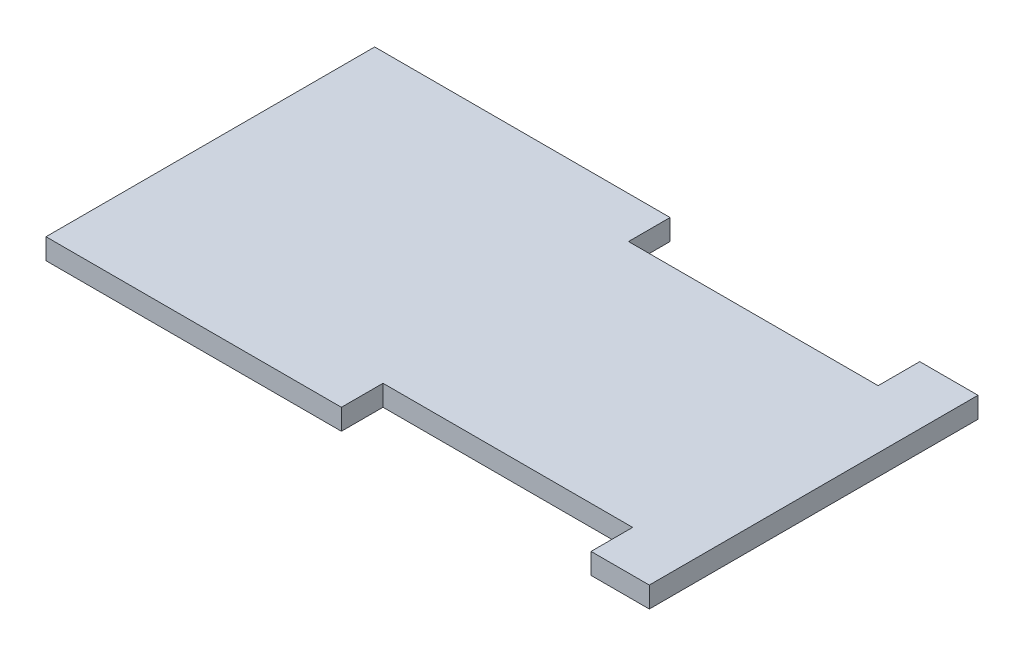
ISO-10303-21;
HEADER;
FILE_DESCRIPTION(('STEP AP214'),'2;1');
FILE_NAME('part.step','',(''),(''),'','','');
FILE_SCHEMA(('AUTOMOTIVE_DESIGN { 1 0 10303 214 1 1 1 1 }'));
ENDSEC;
DATA;
#1=APPLICATION_CONTEXT('core data for automotive mechanical design processes');
#2=APPLICATION_PROTOCOL_DEFINITION('international standard','automotive_design',2000,#1);
#3=PRODUCT_CONTEXT('',#1,'mechanical');
#4=PRODUCT('Part','Part','',(#3));
#5=PRODUCT_RELATED_PRODUCT_CATEGORY('part','',(#4));
#6=PRODUCT_DEFINITION_FORMATION('','',#4);
#7=PRODUCT_DEFINITION_CONTEXT('part definition',#1,'design');
#8=PRODUCT_DEFINITION('design','',#6,#7);
#9=PRODUCT_DEFINITION_SHAPE('','',#8);
#10=(LENGTH_UNIT() NAMED_UNIT(*) SI_UNIT(.MILLI.,.METRE.));
#11=(NAMED_UNIT(*) PLANE_ANGLE_UNIT() SI_UNIT($,.RADIAN.));
#12=(NAMED_UNIT(*) SI_UNIT($,.STERADIAN.) SOLID_ANGLE_UNIT());
#13=UNCERTAINTY_MEASURE_WITH_UNIT(LENGTH_MEASURE(1.E-05),#10,'distance_accuracy_value','');
#14=(GEOMETRIC_REPRESENTATION_CONTEXT(3) GLOBAL_UNCERTAINTY_ASSIGNED_CONTEXT((#13)) GLOBAL_UNIT_ASSIGNED_CONTEXT((#10,
#11,#12)) REPRESENTATION_CONTEXT('',''));
#15=CARTESIAN_POINT('',(0.,0.,0.));
#16=DIRECTION('',(0.,0.,1.));
#17=DIRECTION('',(1.,0.,0.));
#18=AXIS2_PLACEMENT_3D('',#15,#16,#17);
#19=CARTESIAN_POINT('',(-48.2677803983228,5.,44.7422824947589));
#20=DIRECTION('',(0.,0.,-1.));
#21=DIRECTION('',(-1.,0.,0.));
#22=AXIS2_PLACEMENT_3D('',#19,#20,#21);
#23=PLANE('',#22);
#24=DIRECTION('',(1.,0.,0.));
#25=VECTOR('',#24,1.);
#26=CARTESIAN_POINT('',(-48.2677803983228,0.,44.7422824947589));
#27=LINE('',#26,#25);
#28=CARTESIAN_POINT('',(-48.2677803983228,0.,44.7422824947589));
#29=VERTEX_POINT('',#28);
#30=CARTESIAN_POINT('',(22.7322196016772,0.,44.7422824947589));
#31=VERTEX_POINT('',#30);
#32=EDGE_CURVE('E134',#29,#31,#27,.T.);
#33=ORIENTED_EDGE('',*,*,#32,.T.);
#34=DIRECTION('',(0.,1.,0.));
#35=VECTOR('',#34,1.);
#36=CARTESIAN_POINT('',(22.7322196016772,-0.00100000000000013,44.7422824947589));
#37=LINE('',#36,#35);
#38=CARTESIAN_POINT('',(22.7322196016772,5.,44.7422824947589));
#39=VERTEX_POINT('',#38);
#40=EDGE_CURVE('E119',#31,#39,#37,.T.);
#41=ORIENTED_EDGE('',*,*,#40,.T.);
#42=DIRECTION('',(1.,0.,0.));
#43=VECTOR('',#42,1.);
#44=CARTESIAN_POINT('',(-48.2677803983228,5.,44.7422824947589));
#45=LINE('',#44,#43);
#46=CARTESIAN_POINT('',(-48.2677803983228,5.,44.7422824947589));
#47=VERTEX_POINT('',#46);
#48=EDGE_CURVE('E182',#47,#39,#45,.T.);
#49=ORIENTED_EDGE('',*,*,#48,.F.);
#50=DIRECTION('',(0.,-1.,0.));
#51=VECTOR('',#50,1.);
#52=CARTESIAN_POINT('',(-48.2677803983228,5.,44.7422824947589));
#53=LINE('',#52,#51);
#54=EDGE_CURVE('E11',#47,#29,#53,.T.);
#55=ORIENTED_EDGE('',*,*,#54,.T.);
#56=EDGE_LOOP('',(#33,#41,#49,#55));
#57=FACE_BOUND('',#56,.T.);
#58=ADVANCED_FACE('F30',(#57),#23,.F.);
#59=CARTESIAN_POINT('',(-48.2677803983228,5.,-34.2577175052411));
#60=DIRECTION('',(0.,0.,1.));
#61=DIRECTION('',(1.,0.,0.));
#62=AXIS2_PLACEMENT_3D('',#59,#60,#61);
#63=PLANE('',#62);
#64=DIRECTION('',(-1.,0.,0.));
#65=VECTOR('',#64,1.);
#66=CARTESIAN_POINT('',(-48.2677803983228,5.,-34.2577175052411));
#67=LINE('',#66,#65);
#68=CARTESIAN_POINT('',(22.7322196016772,5.,-34.2577175052411));
#69=VERTEX_POINT('',#68);
#70=CARTESIAN_POINT('',(-48.2677803983228,5.,-34.2577175052411));
#71=VERTEX_POINT('',#70);
#72=EDGE_CURVE('E179',#69,#71,#67,.T.);
#73=ORIENTED_EDGE('',*,*,#72,.F.);
#74=DIRECTION('',(0.,1.,0.));
#75=VECTOR('',#74,1.);
#76=CARTESIAN_POINT('',(22.7322196016772,-0.00100000000000013,-34.2577175052411));
#77=LINE('',#76,#75);
#78=CARTESIAN_POINT('',(22.7322196016772,0.,-34.2577175052411));
#79=VERTEX_POINT('',#78);
#80=EDGE_CURVE('E190',#79,#69,#77,.T.);
#81=ORIENTED_EDGE('',*,*,#80,.F.);
#82=DIRECTION('',(-1.,0.,0.));
#83=VECTOR('',#82,1.);
#84=CARTESIAN_POINT('',(-48.2677803983228,0.,-34.2577175052411));
#85=LINE('',#84,#83);
#86=CARTESIAN_POINT('',(-48.2677803983228,0.,-34.2577175052411));
#87=VERTEX_POINT('',#86);
#88=EDGE_CURVE('E142',#79,#87,#85,.T.);
#89=ORIENTED_EDGE('',*,*,#88,.T.);
#90=DIRECTION('',(0.,-1.,0.));
#91=VECTOR('',#90,1.);
#92=CARTESIAN_POINT('',(-48.2677803983228,5.,-34.2577175052411));
#93=LINE('',#92,#91);
#94=EDGE_CURVE('E152',#71,#87,#93,.T.);
#95=ORIENTED_EDGE('',*,*,#94,.F.);
#96=EDGE_LOOP('',(#73,#81,#89,#95));
#97=FACE_BOUND('',#96,.T.);
#98=ADVANCED_FACE('F239',(#97),#63,.F.);
#99=CARTESIAN_POINT('',(-48.2677803983228,5.,-34.2577175052411));
#100=DIRECTION('',(1.,0.,0.));
#101=DIRECTION('',(0.,0.,-1.));
#102=AXIS2_PLACEMENT_3D('',#99,#100,#101);
#103=PLANE('',#102);
#104=DIRECTION('',(0.,0.,1.));
#105=VECTOR('',#104,1.);
#106=CARTESIAN_POINT('',(-48.2677803983228,0.,-34.2577175052411));
#107=LINE('',#106,#105);
#108=EDGE_CURVE('E144',#87,#29,#107,.T.);
#109=ORIENTED_EDGE('',*,*,#108,.T.);
#110=ORIENTED_EDGE('',*,*,#54,.F.);
#111=DIRECTION('',(0.,0.,1.));
#112=VECTOR('',#111,1.);
#113=CARTESIAN_POINT('',(-48.2677803983228,5.,-34.2577175052411));
#114=LINE('',#113,#112);
#115=EDGE_CURVE('E151',#71,#47,#114,.T.);
#116=ORIENTED_EDGE('',*,*,#115,.F.);
#117=ORIENTED_EDGE('',*,*,#94,.T.);
#118=EDGE_LOOP('',(#109,#110,#116,#117));
#119=FACE_BOUND('',#118,.T.);
#120=ADVANCED_FACE('F32',(#119),#103,.F.);
#121=CARTESIAN_POINT('',(82.7322196016772,5.,44.7422824947589));
#122=VERTEX_POINT('',#121);
#123=CARTESIAN_POINT('',(96.7322196016772,5.,44.7422824947589));
#124=VERTEX_POINT('',#123);
#125=EDGE_CURVE('E184',#122,#124,#45,.T.);
#126=ORIENTED_EDGE('',*,*,#125,.F.);
#127=DIRECTION('',(0.,1.,0.));
#128=VECTOR('',#127,1.);
#129=CARTESIAN_POINT('',(82.7322196016772,-0.00100000000000013,44.7422824947589));
#130=LINE('',#129,#128);
#131=CARTESIAN_POINT('',(82.7322196016772,0.,44.7422824947589));
#132=VERTEX_POINT('',#131);
#133=EDGE_CURVE('E128',#132,#122,#130,.T.);
#134=ORIENTED_EDGE('',*,*,#133,.F.);
#135=CARTESIAN_POINT('',(96.7322196016772,0.,44.7422824947589));
#136=VERTEX_POINT('',#135);
#137=EDGE_CURVE('E140',#132,#136,#27,.T.);
#138=ORIENTED_EDGE('',*,*,#137,.T.);
#139=DIRECTION('',(0.,-1.,0.));
#140=VECTOR('',#139,1.);
#141=CARTESIAN_POINT('',(96.7322196016772,5.,44.7422824947589));
#142=LINE('',#141,#140);
#143=EDGE_CURVE('E38',#124,#136,#142,.T.);
#144=ORIENTED_EDGE('',*,*,#143,.F.);
#145=EDGE_LOOP('',(#126,#134,#138,#144));
#146=FACE_BOUND('',#145,.T.);
#147=ADVANCED_FACE('F225',(#146),#23,.F.);
#148=CARTESIAN_POINT('',(96.7322196016772,5.,-34.2577175052411));
#149=DIRECTION('',(-1.,0.,0.));
#150=DIRECTION('',(0.,0.,1.));
#151=AXIS2_PLACEMENT_3D('',#148,#149,#150);
#152=PLANE('',#151);
#153=DIRECTION('',(0.,0.,-1.));
#154=VECTOR('',#153,1.);
#155=CARTESIAN_POINT('',(96.7322196016772,0.,-34.2577175052411));
#156=LINE('',#155,#154);
#157=CARTESIAN_POINT('',(96.7322196016772,0.,-34.2577175052411));
#158=VERTEX_POINT('',#157);
#159=EDGE_CURVE('E139',#136,#158,#156,.T.);
#160=ORIENTED_EDGE('',*,*,#159,.T.);
#161=DIRECTION('',(0.,-1.,0.));
#162=VECTOR('',#161,1.);
#163=CARTESIAN_POINT('',(96.7322196016772,5.,-34.2577175052411));
#164=LINE('',#163,#162);
#165=CARTESIAN_POINT('',(96.7322196016772,5.,-34.2577175052411));
#166=VERTEX_POINT('',#165);
#167=EDGE_CURVE('E155',#166,#158,#164,.T.);
#168=ORIENTED_EDGE('',*,*,#167,.F.);
#169=DIRECTION('',(0.,0.,-1.));
#170=VECTOR('',#169,1.);
#171=CARTESIAN_POINT('',(96.7322196016772,5.,-34.2577175052411));
#172=LINE('',#171,#170);
#173=EDGE_CURVE('E165',#124,#166,#172,.T.);
#174=ORIENTED_EDGE('',*,*,#173,.F.);
#175=ORIENTED_EDGE('',*,*,#143,.T.);
#176=EDGE_LOOP('',(#160,#168,#174,#175));
#177=FACE_BOUND('',#176,.T.);
#178=ADVANCED_FACE('F163',(#177),#152,.F.);
#179=CARTESIAN_POINT('',(82.7322196016772,0.,-34.2577175052411));
#180=VERTEX_POINT('',#179);
#181=EDGE_CURVE('E148',#158,#180,#85,.T.);
#182=ORIENTED_EDGE('',*,*,#181,.T.);
#183=DIRECTION('',(0.,1.,0.));
#184=VECTOR('',#183,1.);
#185=CARTESIAN_POINT('',(82.7322196016772,-0.00100000000000013,-34.2577175052411));
#186=LINE('',#185,#184);
#187=CARTESIAN_POINT('',(82.7322196016772,5.,-34.2577175052411));
#188=VERTEX_POINT('',#187);
#189=EDGE_CURVE('E175',#180,#188,#186,.T.);
#190=ORIENTED_EDGE('',*,*,#189,.T.);
#191=EDGE_CURVE('E156',#166,#188,#67,.T.);
#192=ORIENTED_EDGE('',*,*,#191,.F.);
#193=ORIENTED_EDGE('',*,*,#167,.T.);
#194=EDGE_LOOP('',(#182,#190,#192,#193));
#195=FACE_BOUND('',#194,.T.);
#196=ADVANCED_FACE('F173',(#195),#63,.F.);
#197=CARTESIAN_POINT('',(-48.2677803983228,5.,44.7422824947589));
#198=DIRECTION('',(0.,1.,0.));
#199=DIRECTION('',(0.,0.,1.));
#200=AXIS2_PLACEMENT_3D('',#197,#198,#199);
#201=PLANE('',#200);
#202=DIRECTION('',(0.,0.,1.));
#203=VECTOR('',#202,1.);
#204=CARTESIAN_POINT('',(22.7322196016772,5.,44.7422824947589));
#205=LINE('',#204,#203);
#206=CARTESIAN_POINT('',(22.7322196016772,5.,34.7422824947589));
#207=VERTEX_POINT('',#206);
#208=EDGE_CURVE('E124',#207,#39,#205,.T.);
#209=ORIENTED_EDGE('',*,*,#208,.F.);
#210=DIRECTION('',(-1.,0.,0.));
#211=VECTOR('',#210,1.);
#212=CARTESIAN_POINT('',(22.7322196016772,5.,34.7422824947589));
#213=LINE('',#212,#211);
#214=CARTESIAN_POINT('',(82.7322196016772,5.,34.7422824947589));
#215=VERTEX_POINT('',#214);
#216=EDGE_CURVE('E129',#215,#207,#213,.T.);
#217=ORIENTED_EDGE('',*,*,#216,.F.);
#218=DIRECTION('',(0.,0.,-1.));
#219=VECTOR('',#218,1.);
#220=CARTESIAN_POINT('',(82.7322196016772,5.,44.7422824947589));
#221=LINE('',#220,#219);
#222=EDGE_CURVE('E215',#122,#215,#221,.T.);
#223=ORIENTED_EDGE('',*,*,#222,.F.);
#224=ORIENTED_EDGE('',*,*,#125,.T.);
#225=ORIENTED_EDGE('',*,*,#173,.T.);
#226=ORIENTED_EDGE('',*,*,#191,.T.);
#227=DIRECTION('',(0.,0.,-1.));
#228=VECTOR('',#227,1.);
#229=CARTESIAN_POINT('',(82.7322196016772,5.,-34.2577175052411));
#230=LINE('',#229,#228);
#231=CARTESIAN_POINT('',(82.7322196016772,5.,-24.2577175052411));
#232=VERTEX_POINT('',#231);
#233=EDGE_CURVE('E194',#232,#188,#230,.T.);
#234=ORIENTED_EDGE('',*,*,#233,.F.);
#235=DIRECTION('',(1.,0.,0.));
#236=VECTOR('',#235,1.);
#237=CARTESIAN_POINT('',(22.7322196016772,5.,-24.2577175052411));
#238=LINE('',#237,#236);
#239=CARTESIAN_POINT('',(22.7322196016772,5.,-24.2577175052411));
#240=VERTEX_POINT('',#239);
#241=EDGE_CURVE('E199',#240,#232,#238,.T.);
#242=ORIENTED_EDGE('',*,*,#241,.F.);
#243=DIRECTION('',(0.,0.,1.));
#244=VECTOR('',#243,1.);
#245=CARTESIAN_POINT('',(22.7322196016772,5.,-34.2577175052411));
#246=LINE('',#245,#244);
#247=EDGE_CURVE('E202',#69,#240,#246,.T.);
#248=ORIENTED_EDGE('',*,*,#247,.F.);
#249=ORIENTED_EDGE('',*,*,#72,.T.);
#250=ORIENTED_EDGE('',*,*,#115,.T.);
#251=ORIENTED_EDGE('',*,*,#48,.T.);
#252=EDGE_LOOP('',(#209,#217,#223,#224,#225,#226,#234,#242,#248,#249,#250,#251));
#253=FACE_BOUND('',#252,.T.);
#254=ADVANCED_FACE('F226',(#253),#201,.T.);
#255=CARTESIAN_POINT('',(-48.2677803983228,0.,44.7422824947589));
#256=DIRECTION('',(0.,1.,0.));
#257=DIRECTION('',(0.,0.,1.));
#258=AXIS2_PLACEMENT_3D('',#255,#256,#257);
#259=PLANE('',#258);
#260=DIRECTION('',(1.,0.,0.));
#261=VECTOR('',#260,1.);
#262=CARTESIAN_POINT('',(22.7322196016772,0.,34.7422824947589));
#263=LINE('',#262,#261);
#264=CARTESIAN_POINT('',(22.7322196016772,0.,34.7422824947589));
#265=VERTEX_POINT('',#264);
#266=CARTESIAN_POINT('',(82.7322196016772,0.,34.7422824947589));
#267=VERTEX_POINT('',#266);
#268=EDGE_CURVE('E45',#265,#267,#263,.T.);
#269=ORIENTED_EDGE('',*,*,#268,.F.);
#270=DIRECTION('',(0.,0.,-1.));
#271=VECTOR('',#270,1.);
#272=CARTESIAN_POINT('',(22.7322196016772,0.,44.7422824947589));
#273=LINE('',#272,#271);
#274=EDGE_CURVE('E122',#31,#265,#273,.T.);
#275=ORIENTED_EDGE('',*,*,#274,.F.);
#276=ORIENTED_EDGE('',*,*,#32,.F.);
#277=ORIENTED_EDGE('',*,*,#108,.F.);
#278=ORIENTED_EDGE('',*,*,#88,.F.);
#279=DIRECTION('',(0.,0.,-1.));
#280=VECTOR('',#279,1.);
#281=CARTESIAN_POINT('',(22.7322196016772,0.,-34.2577175052411));
#282=LINE('',#281,#280);
#283=CARTESIAN_POINT('',(22.7322196016772,0.,-24.2577175052411));
#284=VERTEX_POINT('',#283);
#285=EDGE_CURVE('E205',#284,#79,#282,.T.);
#286=ORIENTED_EDGE('',*,*,#285,.F.);
#287=DIRECTION('',(-1.,0.,0.));
#288=VECTOR('',#287,1.);
#289=CARTESIAN_POINT('',(22.7322196016772,0.,-24.2577175052411));
#290=LINE('',#289,#288);
#291=CARTESIAN_POINT('',(82.7322196016772,0.,-24.2577175052411));
#292=VERTEX_POINT('',#291);
#293=EDGE_CURVE('E187',#292,#284,#290,.T.);
#294=ORIENTED_EDGE('',*,*,#293,.F.);
#295=DIRECTION('',(0.,0.,1.));
#296=VECTOR('',#295,1.);
#297=CARTESIAN_POINT('',(82.7322196016772,0.,-34.2577175052411));
#298=LINE('',#297,#296);
#299=EDGE_CURVE('E53',#180,#292,#298,.T.);
#300=ORIENTED_EDGE('',*,*,#299,.F.);
#301=ORIENTED_EDGE('',*,*,#181,.F.);
#302=ORIENTED_EDGE('',*,*,#159,.F.);
#303=ORIENTED_EDGE('',*,*,#137,.F.);
#304=DIRECTION('',(0.,0.,1.));
#305=VECTOR('',#304,1.);
#306=CARTESIAN_POINT('',(82.7322196016772,0.,44.7422824947589));
#307=LINE('',#306,#305);
#308=EDGE_CURVE('E220',#267,#132,#307,.T.);
#309=ORIENTED_EDGE('',*,*,#308,.F.);
#310=EDGE_LOOP('',(#269,#275,#276,#277,#278,#286,#294,#300,#301,#302,#303,#309));
#311=FACE_BOUND('',#310,.T.);
#312=ADVANCED_FACE('F132',(#311),#259,.F.);
#313=CARTESIAN_POINT('',(22.7322196016772,-0.00100000000000013,-34.2577175052411));
#314=DIRECTION('',(-1.,0.,0.));
#315=DIRECTION('',(0.,0.,1.));
#316=AXIS2_PLACEMENT_3D('',#313,#314,#315);
#317=PLANE('',#316);
#318=ORIENTED_EDGE('',*,*,#285,.T.);
#319=ORIENTED_EDGE('',*,*,#80,.T.);
#320=ORIENTED_EDGE('',*,*,#247,.T.);
#321=DIRECTION('',(0.,1.,0.));
#322=VECTOR('',#321,1.);
#323=CARTESIAN_POINT('',(22.7322196016772,-0.00100000000000013,-24.2577175052411));
#324=LINE('',#323,#322);
#325=EDGE_CURVE('E191',#284,#240,#324,.T.);
#326=ORIENTED_EDGE('',*,*,#325,.F.);
#327=EDGE_LOOP('',(#318,#319,#320,#326));
#328=FACE_BOUND('',#327,.T.);
#329=ADVANCED_FACE('F262',(#328),#317,.F.);
#330=CARTESIAN_POINT('',(82.7322196016772,-0.00100000000000013,-34.2577175052411));
#331=DIRECTION('',(1.,0.,0.));
#332=DIRECTION('',(0.,0.,-1.));
#333=AXIS2_PLACEMENT_3D('',#330,#331,#332);
#334=PLANE('',#333);
#335=ORIENTED_EDGE('',*,*,#299,.T.);
#336=DIRECTION('',(0.,1.,0.));
#337=VECTOR('',#336,1.);
#338=CARTESIAN_POINT('',(82.7322196016772,-0.00100000000000013,-24.2577175052411));
#339=LINE('',#338,#337);
#340=EDGE_CURVE('E193',#292,#232,#339,.T.);
#341=ORIENTED_EDGE('',*,*,#340,.T.);
#342=ORIENTED_EDGE('',*,*,#233,.T.);
#343=ORIENTED_EDGE('',*,*,#189,.F.);
#344=EDGE_LOOP('',(#335,#341,#342,#343));
#345=FACE_BOUND('',#344,.T.);
#346=ADVANCED_FACE('F265',(#345),#334,.F.);
#347=CARTESIAN_POINT('',(22.7322196016772,-0.00100000000000013,-24.2577175052411));
#348=DIRECTION('',(0.,0.,1.));
#349=DIRECTION('',(1.,0.,0.));
#350=AXIS2_PLACEMENT_3D('',#347,#348,#349);
#351=PLANE('',#350);
#352=ORIENTED_EDGE('',*,*,#293,.T.);
#353=ORIENTED_EDGE('',*,*,#325,.T.);
#354=ORIENTED_EDGE('',*,*,#241,.T.);
#355=ORIENTED_EDGE('',*,*,#340,.F.);
#356=EDGE_LOOP('',(#352,#353,#354,#355));
#357=FACE_BOUND('',#356,.T.);
#358=ADVANCED_FACE('F236',(#357),#351,.F.);
#359=CARTESIAN_POINT('',(22.7322196016772,-0.00100000000000013,44.7422824947589));
#360=DIRECTION('',(-1.,0.,0.));
#361=DIRECTION('',(0.,0.,1.));
#362=AXIS2_PLACEMENT_3D('',#359,#360,#361);
#363=PLANE('',#362);
#364=ORIENTED_EDGE('',*,*,#274,.T.);
#365=DIRECTION('',(0.,1.,0.));
#366=VECTOR('',#365,1.);
#367=CARTESIAN_POINT('',(22.7322196016772,-0.00100000000000013,34.7422824947589));
#368=LINE('',#367,#366);
#369=EDGE_CURVE('E207',#265,#207,#368,.T.);
#370=ORIENTED_EDGE('',*,*,#369,.T.);
#371=ORIENTED_EDGE('',*,*,#208,.T.);
#372=ORIENTED_EDGE('',*,*,#40,.F.);
#373=EDGE_LOOP('',(#364,#370,#371,#372));
#374=FACE_BOUND('',#373,.T.);
#375=ADVANCED_FACE('F121',(#374),#363,.F.);
#376=CARTESIAN_POINT('',(22.7322196016772,-0.00100000000000013,34.7422824947589));
#377=DIRECTION('',(0.,0.,-1.));
#378=DIRECTION('',(-1.,0.,0.));
#379=AXIS2_PLACEMENT_3D('',#376,#377,#378);
#380=PLANE('',#379);
#381=ORIENTED_EDGE('',*,*,#268,.T.);
#382=DIRECTION('',(0.,1.,0.));
#383=VECTOR('',#382,1.);
#384=CARTESIAN_POINT('',(82.7322196016772,-0.00100000000000013,34.7422824947589));
#385=LINE('',#384,#383);
#386=EDGE_CURVE('E210',#267,#215,#385,.T.);
#387=ORIENTED_EDGE('',*,*,#386,.T.);
#388=ORIENTED_EDGE('',*,*,#216,.T.);
#389=ORIENTED_EDGE('',*,*,#369,.F.);
#390=EDGE_LOOP('',(#381,#387,#388,#389));
#391=FACE_BOUND('',#390,.T.);
#392=ADVANCED_FACE('F228',(#391),#380,.F.);
#393=CARTESIAN_POINT('',(82.7322196016772,-0.00100000000000013,44.7422824947589));
#394=DIRECTION('',(1.,0.,0.));
#395=DIRECTION('',(0.,0.,-1.));
#396=AXIS2_PLACEMENT_3D('',#393,#394,#395);
#397=PLANE('',#396);
#398=ORIENTED_EDGE('',*,*,#308,.T.);
#399=ORIENTED_EDGE('',*,*,#133,.T.);
#400=ORIENTED_EDGE('',*,*,#222,.T.);
#401=ORIENTED_EDGE('',*,*,#386,.F.);
#402=EDGE_LOOP('',(#398,#399,#400,#401));
#403=FACE_BOUND('',#402,.T.);
#404=ADVANCED_FACE('F223',(#403),#397,.F.);
#405=CLOSED_SHELL('',(#58,#98,#120,#147,#178,#196,#254,#312,#329,#346,#358,#375,#392,#404));
#406=MANIFOLD_SOLID_BREP('B2',#405);
#407=ADVANCED_BREP_SHAPE_REPRESENTATION('',(#18,#406),#14);
#408=SHAPE_DEFINITION_REPRESENTATION(#9,#407);
ENDSEC;
END-ISO-10303-21;
